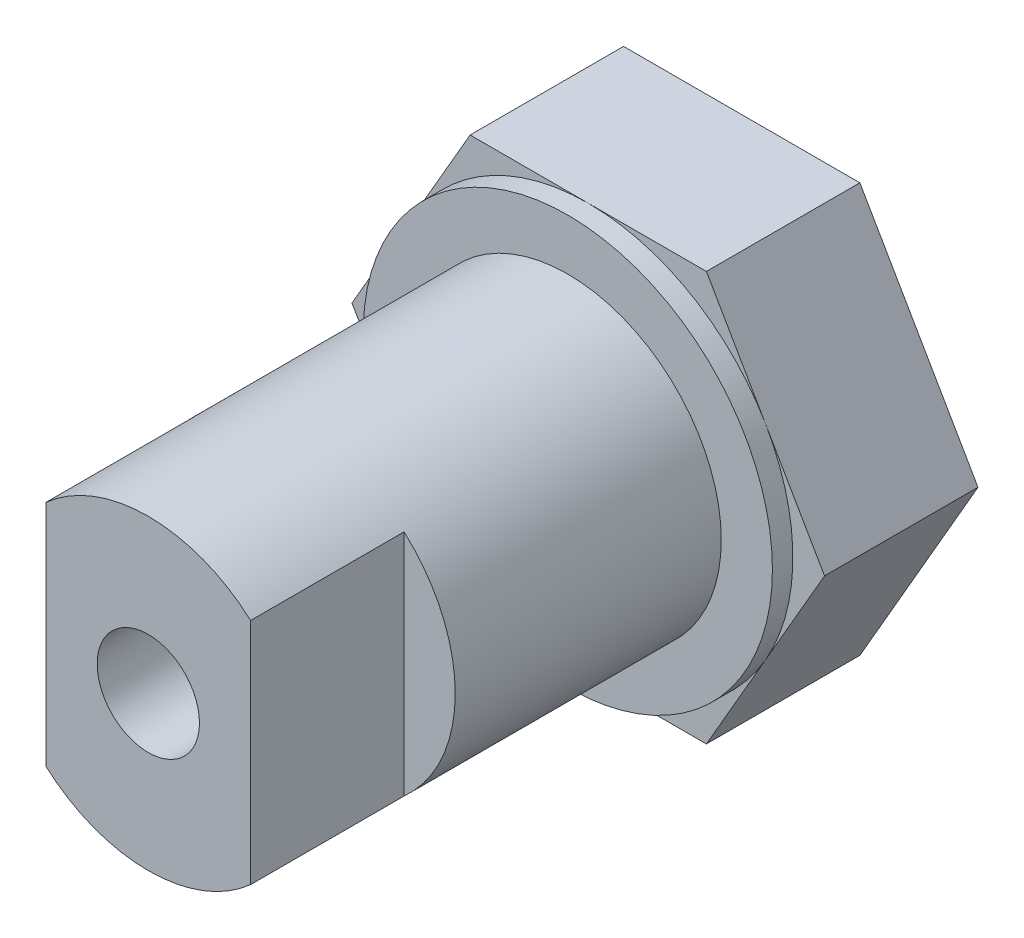
ISO-10303-21;
HEADER;
FILE_DESCRIPTION(('STEP AP214'),'2;1');
FILE_NAME('part.step','',(''),(''),'','','');
FILE_SCHEMA(('AUTOMOTIVE_DESIGN { 1 0 10303 214 1 1 1 1 }'));
ENDSEC;
DATA;
#1=APPLICATION_CONTEXT('core data for automotive mechanical design processes');
#2=APPLICATION_PROTOCOL_DEFINITION('international standard','automotive_design',2000,#1);
#3=PRODUCT_CONTEXT('',#1,'mechanical');
#4=PRODUCT('Part','Part','',(#3));
#5=PRODUCT_RELATED_PRODUCT_CATEGORY('part','',(#4));
#6=PRODUCT_DEFINITION_FORMATION('','',#4);
#7=PRODUCT_DEFINITION_CONTEXT('part definition',#1,'design');
#8=PRODUCT_DEFINITION('design','',#6,#7);
#9=PRODUCT_DEFINITION_SHAPE('','',#8);
#10=(LENGTH_UNIT() NAMED_UNIT(*) SI_UNIT(.MILLI.,.METRE.));
#11=(NAMED_UNIT(*) PLANE_ANGLE_UNIT() SI_UNIT($,.RADIAN.));
#12=(NAMED_UNIT(*) SI_UNIT($,.STERADIAN.) SOLID_ANGLE_UNIT());
#13=UNCERTAINTY_MEASURE_WITH_UNIT(LENGTH_MEASURE(1.E-05),#10,'distance_accuracy_value','');
#14=(GEOMETRIC_REPRESENTATION_CONTEXT(3) GLOBAL_UNCERTAINTY_ASSIGNED_CONTEXT((#13)) GLOBAL_UNIT_ASSIGNED_CONTEXT((#10,
#11,#12)) REPRESENTATION_CONTEXT('',''));
#15=CARTESIAN_POINT('',(0.,0.,0.));
#16=DIRECTION('',(0.,0.,1.));
#17=DIRECTION('',(1.,0.,0.));
#18=AXIS2_PLACEMENT_3D('',#15,#16,#17);
#19=CARTESIAN_POINT('',(0.,0.,58.));
#20=DIRECTION('',(0.,0.,-1.));
#21=DIRECTION('',(-1.,0.,0.));
#22=AXIS2_PLACEMENT_3D('',#19,#20,#21);
#23=CYLINDRICAL_SURFACE('',#22,15.);
#24=CARTESIAN_POINT('',(0.,0.,17.));
#25=DIRECTION('',(0.,0.,1.));
#26=DIRECTION('',(1.,0.,0.));
#27=AXIS2_PLACEMENT_3D('',#24,#25,#26);
#28=CIRCLE('',#27,15.);
#29=CARTESIAN_POINT('',(15.,0.,17.));
#30=VERTEX_POINT('',#29);
#31=EDGE_CURVE('E178',#30,#30,#28,.T.);
#32=ORIENTED_EDGE('',*,*,#31,.T.);
#33=EDGE_LOOP('',(#32));
#34=FACE_BOUND('',#33,.T.);
#35=DIRECTION('',(0.,0.,1.));
#36=VECTOR('',#35,1.);
#37=CARTESIAN_POINT('',(10.,-11.1803398874989,43.));
#38=LINE('',#37,#36);
#39=CARTESIAN_POINT('',(10.,-11.1803398874989,43.));
#40=VERTEX_POINT('',#39);
#41=CARTESIAN_POINT('',(10.,-11.1803398874989,58.));
#42=VERTEX_POINT('',#41);
#43=EDGE_CURVE('E141',#40,#42,#38,.T.);
#44=ORIENTED_EDGE('',*,*,#43,.T.);
#45=CARTESIAN_POINT('',(0.,0.,58.));
#46=DIRECTION('',(0.,0.,1.));
#47=DIRECTION('',(1.,0.,0.));
#48=AXIS2_PLACEMENT_3D('',#45,#46,#47);
#49=CIRCLE('',#48,15.);
#50=CARTESIAN_POINT('',(-10.,-11.1803398874989,58.));
#51=VERTEX_POINT('',#50);
#52=EDGE_CURVE('E179',#51,#42,#49,.T.);
#53=ORIENTED_EDGE('',*,*,#52,.F.);
#54=DIRECTION('',(0.,0.,1.));
#55=VECTOR('',#54,1.);
#56=CARTESIAN_POINT('',(-10.,-11.1803398874989,43.));
#57=LINE('',#56,#55);
#58=CARTESIAN_POINT('',(-10.,-11.1803398874989,43.));
#59=VERTEX_POINT('',#58);
#60=EDGE_CURVE('E70',#59,#51,#57,.T.);
#61=ORIENTED_EDGE('',*,*,#60,.F.);
#62=CARTESIAN_POINT('',(0.,0.,43.));
#63=DIRECTION('',(0.,0.,1.));
#64=DIRECTION('',(1.,0.,0.));
#65=AXIS2_PLACEMENT_3D('',#62,#63,#64);
#66=CIRCLE('',#65,15.);
#67=CARTESIAN_POINT('',(-10.,11.1803398874989,43.));
#68=VERTEX_POINT('',#67);
#69=EDGE_CURVE('E164',#68,#59,#66,.T.);
#70=ORIENTED_EDGE('',*,*,#69,.F.);
#71=DIRECTION('',(0.,0.,1.));
#72=VECTOR('',#71,1.);
#73=CARTESIAN_POINT('',(-10.,11.1803398874989,43.));
#74=LINE('',#73,#72);
#75=CARTESIAN_POINT('',(-10.,11.1803398874989,58.));
#76=VERTEX_POINT('',#75);
#77=EDGE_CURVE('E167',#68,#76,#74,.T.);
#78=ORIENTED_EDGE('',*,*,#77,.T.);
#79=CARTESIAN_POINT('',(10.,11.1803398874989,58.));
#80=VERTEX_POINT('',#79);
#81=EDGE_CURVE('E181',#80,#76,#49,.T.);
#82=ORIENTED_EDGE('',*,*,#81,.F.);
#83=DIRECTION('',(0.,0.,1.));
#84=VECTOR('',#83,1.);
#85=CARTESIAN_POINT('',(10.,11.1803398874989,43.));
#86=LINE('',#85,#84);
#87=CARTESIAN_POINT('',(10.,11.1803398874989,43.));
#88=VERTEX_POINT('',#87);
#89=EDGE_CURVE('E62',#88,#80,#86,.T.);
#90=ORIENTED_EDGE('',*,*,#89,.F.);
#91=CARTESIAN_POINT('',(0.,0.,43.));
#92=DIRECTION('',(0.,0.,1.));
#93=DIRECTION('',(1.,0.,0.));
#94=AXIS2_PLACEMENT_3D('',#91,#92,#93);
#95=CIRCLE('',#94,15.);
#96=EDGE_CURVE('E151',#40,#88,#95,.T.);
#97=ORIENTED_EDGE('',*,*,#96,.F.);
#98=EDGE_LOOP('',(#44,#53,#61,#70,#78,#82,#90,#97));
#99=FACE_BOUND('',#98,.T.);
#100=ADVANCED_FACE('F44',(#34,#99),#23,.T.);
#101=CARTESIAN_POINT('',(0.,0.,58.));
#102=DIRECTION('',(0.,0.,1.));
#103=DIRECTION('',(1.,0.,0.));
#104=AXIS2_PLACEMENT_3D('',#101,#102,#103);
#105=PLANE('',#104);
#106=CARTESIAN_POINT('',(0.,0.,58.));
#107=DIRECTION('',(0.,0.,1.));
#108=DIRECTION('',(1.,0.,0.));
#109=AXIS2_PLACEMENT_3D('',#106,#107,#108);
#110=CIRCLE('',#109,5.);
#111=CARTESIAN_POINT('',(5.,0.,58.));
#112=VERTEX_POINT('',#111);
#113=EDGE_CURVE('E170',#112,#112,#110,.T.);
#114=ORIENTED_EDGE('',*,*,#113,.F.);
#115=EDGE_LOOP('',(#114));
#116=FACE_BOUND('',#115,.T.);
#117=ORIENTED_EDGE('',*,*,#52,.T.);
#118=DIRECTION('',(0.,1.,0.));
#119=VECTOR('',#118,1.);
#120=CARTESIAN_POINT('',(10.,0.,58.));
#121=LINE('',#120,#119);
#122=EDGE_CURVE('E146',#42,#80,#121,.T.);
#123=ORIENTED_EDGE('',*,*,#122,.T.);
#124=ORIENTED_EDGE('',*,*,#81,.T.);
#125=DIRECTION('',(0.,-1.,0.));
#126=VECTOR('',#125,1.);
#127=CARTESIAN_POINT('',(-10.,0.,58.));
#128=LINE('',#127,#126);
#129=EDGE_CURVE('E160',#76,#51,#128,.T.);
#130=ORIENTED_EDGE('',*,*,#129,.T.);
#131=EDGE_LOOP('',(#117,#123,#124,#130));
#132=FACE_BOUND('',#131,.T.);
#133=ADVANCED_FACE('F297',(#116,#132),#105,.T.);
#134=CARTESIAN_POINT('',(0.,0.,15.));
#135=DIRECTION('',(0.,0.,1.));
#136=DIRECTION('',(1.,0.,0.));
#137=AXIS2_PLACEMENT_3D('',#134,#135,#136);
#138=PLANE('',#137);
#139=CARTESIAN_POINT('',(0.,0.,15.));
#140=DIRECTION('',(0.,0.,1.));
#141=DIRECTION('',(1.,0.,0.));
#142=AXIS2_PLACEMENT_3D('',#139,#140,#141);
#143=CIRCLE('',#142,20.);
#144=CARTESIAN_POINT('',(17.3205080756888,10.,15.));
#145=VERTEX_POINT('',#144);
#146=CARTESIAN_POINT('',(0.,20.,15.));
#147=VERTEX_POINT('',#146);
#148=EDGE_CURVE('E55',#145,#147,#143,.T.);
#149=ORIENTED_EDGE('',*,*,#148,.F.);
#150=DIRECTION('',(-0.5,0.866025403784438,0.));
#151=VECTOR('',#150,1.);
#152=CARTESIAN_POINT('',(23.094010767585,0.,15.));
#153=LINE('',#152,#151);
#154=CARTESIAN_POINT('',(11.5470053837925,20.,15.));
#155=VERTEX_POINT('',#154);
#156=EDGE_CURVE('E193',#145,#155,#153,.T.);
#157=ORIENTED_EDGE('',*,*,#156,.T.);
#158=DIRECTION('',(-1.,0.,0.));
#159=VECTOR('',#158,1.);
#160=CARTESIAN_POINT('',(11.5470053837925,20.,15.));
#161=LINE('',#160,#159);
#162=EDGE_CURVE('E194',#155,#147,#161,.T.);
#163=ORIENTED_EDGE('',*,*,#162,.T.);
#164=EDGE_LOOP('',(#149,#157,#163));
#165=FACE_BOUND('',#164,.T.);
#166=ADVANCED_FACE('F295',(#165),#138,.T.);
#167=CARTESIAN_POINT('',(-17.3205080756888,10.,15.));
#168=VERTEX_POINT('',#167);
#169=EDGE_CURVE('E13',#147,#168,#143,.T.);
#170=ORIENTED_EDGE('',*,*,#169,.F.);
#171=CARTESIAN_POINT('',(-11.5470053837925,20.,15.));
#172=VERTEX_POINT('',#171);
#173=EDGE_CURVE('E192',#147,#172,#161,.T.);
#174=ORIENTED_EDGE('',*,*,#173,.T.);
#175=DIRECTION('',(-0.5,-0.866025403784439,0.));
#176=VECTOR('',#175,1.);
#177=CARTESIAN_POINT('',(-11.5470053837925,20.,15.));
#178=LINE('',#177,#176);
#179=EDGE_CURVE('E198',#172,#168,#178,.T.);
#180=ORIENTED_EDGE('',*,*,#179,.T.);
#181=EDGE_LOOP('',(#170,#174,#180));
#182=FACE_BOUND('',#181,.T.);
#183=ADVANCED_FACE('F261',(#182),#138,.T.);
#184=CARTESIAN_POINT('',(-17.3205080756888,-10.,15.));
#185=VERTEX_POINT('',#184);
#186=EDGE_CURVE('E53',#168,#185,#143,.T.);
#187=ORIENTED_EDGE('',*,*,#186,.F.);
#188=CARTESIAN_POINT('',(-23.094010767585,0.,15.));
#189=VERTEX_POINT('',#188);
#190=EDGE_CURVE('E197',#168,#189,#178,.T.);
#191=ORIENTED_EDGE('',*,*,#190,.T.);
#192=DIRECTION('',(0.5,-0.866025403784438,0.));
#193=VECTOR('',#192,1.);
#194=CARTESIAN_POINT('',(-23.094010767585,0.,15.));
#195=LINE('',#194,#193);
#196=EDGE_CURVE('E202',#189,#185,#195,.T.);
#197=ORIENTED_EDGE('',*,*,#196,.T.);
#198=EDGE_LOOP('',(#187,#191,#197));
#199=FACE_BOUND('',#198,.T.);
#200=ADVANCED_FACE('F256',(#199),#138,.T.);
#201=CARTESIAN_POINT('',(0.,-20.,15.));
#202=VERTEX_POINT('',#201);
#203=EDGE_CURVE('E250',#185,#202,#143,.T.);
#204=ORIENTED_EDGE('',*,*,#203,.F.);
#205=CARTESIAN_POINT('',(-11.5470053837925,-20.,15.));
#206=VERTEX_POINT('',#205);
#207=EDGE_CURVE('E201',#185,#206,#195,.T.);
#208=ORIENTED_EDGE('',*,*,#207,.T.);
#209=DIRECTION('',(1.,0.,0.));
#210=VECTOR('',#209,1.);
#211=CARTESIAN_POINT('',(-11.5470053837925,-20.,15.));
#212=LINE('',#211,#210);
#213=EDGE_CURVE('E206',#206,#202,#212,.T.);
#214=ORIENTED_EDGE('',*,*,#213,.T.);
#215=EDGE_LOOP('',(#204,#208,#214));
#216=FACE_BOUND('',#215,.T.);
#217=ADVANCED_FACE('F276',(#216),#138,.T.);
#218=CARTESIAN_POINT('',(17.3205080756888,-9.99999999999999,15.));
#219=VERTEX_POINT('',#218);
#220=EDGE_CURVE('E247',#202,#219,#143,.T.);
#221=ORIENTED_EDGE('',*,*,#220,.F.);
#222=CARTESIAN_POINT('',(11.5470053837925,-20.,15.));
#223=VERTEX_POINT('',#222);
#224=EDGE_CURVE('E205',#202,#223,#212,.T.);
#225=ORIENTED_EDGE('',*,*,#224,.T.);
#226=DIRECTION('',(0.5,0.866025403784439,0.));
#227=VECTOR('',#226,1.);
#228=CARTESIAN_POINT('',(11.5470053837925,-20.,15.));
#229=LINE('',#228,#227);
#230=EDGE_CURVE('E210',#223,#219,#229,.T.);
#231=ORIENTED_EDGE('',*,*,#230,.T.);
#232=EDGE_LOOP('',(#221,#225,#231));
#233=FACE_BOUND('',#232,.T.);
#234=ADVANCED_FACE('F283',(#233),#138,.T.);
#235=CARTESIAN_POINT('',(23.094010767585,0.,15.));
#236=DIRECTION('',(-0.866025403784439,-0.5,0.));
#237=DIRECTION('',(0.5,-0.866025403784439,0.));
#238=AXIS2_PLACEMENT_3D('',#235,#236,#237);
#239=PLANE('',#238);
#240=DIRECTION('',(-0.5,0.866025403784438,0.));
#241=VECTOR('',#240,1.);
#242=CARTESIAN_POINT('',(23.094010767585,0.,0.));
#243=LINE('',#242,#241);
#244=CARTESIAN_POINT('',(23.094010767585,0.,0.));
#245=VERTEX_POINT('',#244);
#246=CARTESIAN_POINT('',(11.5470053837925,20.,0.));
#247=VERTEX_POINT('',#246);
#248=EDGE_CURVE('E186',#245,#247,#243,.T.);
#249=ORIENTED_EDGE('',*,*,#248,.T.);
#250=DIRECTION('',(0.,0.,-1.));
#251=VECTOR('',#250,1.);
#252=CARTESIAN_POINT('',(11.5470053837925,20.,15.));
#253=LINE('',#252,#251);
#254=EDGE_CURVE('E48',#155,#247,#253,.T.);
#255=ORIENTED_EDGE('',*,*,#254,.F.);
#256=ORIENTED_EDGE('',*,*,#156,.F.);
#257=CARTESIAN_POINT('',(23.094010767585,0.,15.));
#258=VERTEX_POINT('',#257);
#259=EDGE_CURVE('E190',#258,#145,#153,.T.);
#260=ORIENTED_EDGE('',*,*,#259,.F.);
#261=DIRECTION('',(0.,0.,-1.));
#262=VECTOR('',#261,1.);
#263=CARTESIAN_POINT('',(23.094010767585,0.,15.));
#264=LINE('',#263,#262);
#265=EDGE_CURVE('E213',#258,#245,#264,.T.);
#266=ORIENTED_EDGE('',*,*,#265,.T.);
#267=EDGE_LOOP('',(#249,#255,#256,#260,#266));
#268=FACE_BOUND('',#267,.T.);
#269=ADVANCED_FACE('F46',(#268),#239,.F.);
#270=CARTESIAN_POINT('',(11.5470053837925,20.,15.));
#271=DIRECTION('',(0.,-1.,0.));
#272=DIRECTION('',(0.,0.,-1.));
#273=AXIS2_PLACEMENT_3D('',#270,#271,#272);
#274=PLANE('',#273);
#275=DIRECTION('',(-1.,0.,0.));
#276=VECTOR('',#275,1.);
#277=CARTESIAN_POINT('',(11.5470053837925,20.,0.));
#278=LINE('',#277,#276);
#279=CARTESIAN_POINT('',(-11.5470053837925,20.,0.));
#280=VERTEX_POINT('',#279);
#281=EDGE_CURVE('E216',#247,#280,#278,.T.);
#282=ORIENTED_EDGE('',*,*,#281,.T.);
#283=DIRECTION('',(0.,0.,-1.));
#284=VECTOR('',#283,1.);
#285=CARTESIAN_POINT('',(-11.5470053837925,20.,15.));
#286=LINE('',#285,#284);
#287=EDGE_CURVE('E236',#172,#280,#286,.T.);
#288=ORIENTED_EDGE('',*,*,#287,.F.);
#289=ORIENTED_EDGE('',*,*,#173,.F.);
#290=ORIENTED_EDGE('',*,*,#162,.F.);
#291=ORIENTED_EDGE('',*,*,#254,.T.);
#292=EDGE_LOOP('',(#282,#288,#289,#290,#291));
#293=FACE_BOUND('',#292,.T.);
#294=ADVANCED_FACE('F263',(#293),#274,.F.);
#295=CARTESIAN_POINT('',(-11.5470053837925,20.,15.));
#296=DIRECTION('',(0.866025403784439,-0.5,0.));
#297=DIRECTION('',(0.5,0.866025403784439,0.));
#298=AXIS2_PLACEMENT_3D('',#295,#296,#297);
#299=PLANE('',#298);
#300=DIRECTION('',(-0.5,-0.866025403784439,0.));
#301=VECTOR('',#300,1.);
#302=CARTESIAN_POINT('',(-11.5470053837925,20.,0.));
#303=LINE('',#302,#301);
#304=CARTESIAN_POINT('',(-23.094010767585,0.,0.));
#305=VERTEX_POINT('',#304);
#306=EDGE_CURVE('E218',#280,#305,#303,.T.);
#307=ORIENTED_EDGE('',*,*,#306,.T.);
#308=DIRECTION('',(0.,0.,-1.));
#309=VECTOR('',#308,1.);
#310=CARTESIAN_POINT('',(-23.094010767585,0.,15.));
#311=LINE('',#310,#309);
#312=EDGE_CURVE('E234',#189,#305,#311,.T.);
#313=ORIENTED_EDGE('',*,*,#312,.F.);
#314=ORIENTED_EDGE('',*,*,#190,.F.);
#315=ORIENTED_EDGE('',*,*,#179,.F.);
#316=ORIENTED_EDGE('',*,*,#287,.T.);
#317=EDGE_LOOP('',(#307,#313,#314,#315,#316));
#318=FACE_BOUND('',#317,.T.);
#319=ADVANCED_FACE('F259',(#318),#299,.F.);
#320=CARTESIAN_POINT('',(-23.094010767585,0.,15.));
#321=DIRECTION('',(0.866025403784438,0.5,0.));
#322=DIRECTION('',(-0.5,0.866025403784439,0.));
#323=AXIS2_PLACEMENT_3D('',#320,#321,#322);
#324=PLANE('',#323);
#325=DIRECTION('',(0.5,-0.866025403784438,0.));
#326=VECTOR('',#325,1.);
#327=CARTESIAN_POINT('',(-23.094010767585,0.,0.));
#328=LINE('',#327,#326);
#329=CARTESIAN_POINT('',(-11.5470053837925,-20.,0.));
#330=VERTEX_POINT('',#329);
#331=EDGE_CURVE('E220',#305,#330,#328,.T.);
#332=ORIENTED_EDGE('',*,*,#331,.T.);
#333=DIRECTION('',(0.,0.,-1.));
#334=VECTOR('',#333,1.);
#335=CARTESIAN_POINT('',(-11.5470053837925,-20.,15.));
#336=LINE('',#335,#334);
#337=EDGE_CURVE('E231',#206,#330,#336,.T.);
#338=ORIENTED_EDGE('',*,*,#337,.F.);
#339=ORIENTED_EDGE('',*,*,#207,.F.);
#340=ORIENTED_EDGE('',*,*,#196,.F.);
#341=ORIENTED_EDGE('',*,*,#312,.T.);
#342=EDGE_LOOP('',(#332,#338,#339,#340,#341));
#343=FACE_BOUND('',#342,.T.);
#344=ADVANCED_FACE('F271',(#343),#324,.F.);
#345=CARTESIAN_POINT('',(-11.5470053837925,-20.,15.));
#346=DIRECTION('',(0.,1.,0.));
#347=DIRECTION('',(-1.,0.,0.));
#348=AXIS2_PLACEMENT_3D('',#345,#346,#347);
#349=PLANE('',#348);
#350=DIRECTION('',(1.,0.,0.));
#351=VECTOR('',#350,1.);
#352=CARTESIAN_POINT('',(-11.5470053837925,-20.,0.));
#353=LINE('',#352,#351);
#354=CARTESIAN_POINT('',(11.5470053837925,-20.,0.));
#355=VERTEX_POINT('',#354);
#356=EDGE_CURVE('E222',#330,#355,#353,.T.);
#357=ORIENTED_EDGE('',*,*,#356,.T.);
#358=DIRECTION('',(0.,0.,-1.));
#359=VECTOR('',#358,1.);
#360=CARTESIAN_POINT('',(11.5470053837925,-20.,15.));
#361=LINE('',#360,#359);
#362=EDGE_CURVE('E228',#223,#355,#361,.T.);
#363=ORIENTED_EDGE('',*,*,#362,.F.);
#364=ORIENTED_EDGE('',*,*,#224,.F.);
#365=ORIENTED_EDGE('',*,*,#213,.F.);
#366=ORIENTED_EDGE('',*,*,#337,.T.);
#367=EDGE_LOOP('',(#357,#363,#364,#365,#366));
#368=FACE_BOUND('',#367,.T.);
#369=ADVANCED_FACE('F279',(#368),#349,.F.);
#370=CARTESIAN_POINT('',(11.5470053837925,-20.,15.));
#371=DIRECTION('',(-0.866025403784439,0.5,0.));
#372=DIRECTION('',(-0.5,-0.866025403784439,0.));
#373=AXIS2_PLACEMENT_3D('',#370,#371,#372);
#374=PLANE('',#373);
#375=DIRECTION('',(0.5,0.866025403784439,0.));
#376=VECTOR('',#375,1.);
#377=CARTESIAN_POINT('',(11.5470053837925,-20.,0.));
#378=LINE('',#377,#376);
#379=EDGE_CURVE('E224',#355,#245,#378,.T.);
#380=ORIENTED_EDGE('',*,*,#379,.T.);
#381=ORIENTED_EDGE('',*,*,#265,.F.);
#382=EDGE_CURVE('E209',#219,#258,#229,.T.);
#383=ORIENTED_EDGE('',*,*,#382,.F.);
#384=ORIENTED_EDGE('',*,*,#230,.F.);
#385=ORIENTED_EDGE('',*,*,#362,.T.);
#386=EDGE_LOOP('',(#380,#381,#383,#384,#385));
#387=FACE_BOUND('',#386,.T.);
#388=ADVANCED_FACE('F286',(#387),#374,.F.);
#389=EDGE_CURVE('E189',#219,#145,#143,.T.);
#390=ORIENTED_EDGE('',*,*,#389,.F.);
#391=ORIENTED_EDGE('',*,*,#382,.T.);
#392=ORIENTED_EDGE('',*,*,#259,.T.);
#393=EDGE_LOOP('',(#390,#391,#392));
#394=FACE_BOUND('',#393,.T.);
#395=ADVANCED_FACE('F290',(#394),#138,.T.);
#396=CARTESIAN_POINT('',(0.,0.,0.));
#397=DIRECTION('',(0.,0.,1.));
#398=DIRECTION('',(1.,0.,0.));
#399=AXIS2_PLACEMENT_3D('',#396,#397,#398);
#400=PLANE('',#399);
#401=CARTESIAN_POINT('',(0.,0.,0.));
#402=DIRECTION('',(0.,0.,1.));
#403=DIRECTION('',(1.,0.,0.));
#404=AXIS2_PLACEMENT_3D('',#401,#402,#403);
#405=CIRCLE('',#404,5.);
#406=CARTESIAN_POINT('',(5.,0.,0.));
#407=VERTEX_POINT('',#406);
#408=EDGE_CURVE('E175',#407,#407,#405,.T.);
#409=ORIENTED_EDGE('',*,*,#408,.T.);
#410=EDGE_LOOP('',(#409));
#411=FACE_BOUND('',#410,.T.);
#412=ORIENTED_EDGE('',*,*,#248,.F.);
#413=ORIENTED_EDGE('',*,*,#379,.F.);
#414=ORIENTED_EDGE('',*,*,#356,.F.);
#415=ORIENTED_EDGE('',*,*,#331,.F.);
#416=ORIENTED_EDGE('',*,*,#306,.F.);
#417=ORIENTED_EDGE('',*,*,#281,.F.);
#418=EDGE_LOOP('',(#412,#413,#414,#415,#416,#417));
#419=FACE_BOUND('',#418,.T.);
#420=ADVANCED_FACE('F266',(#411,#419),#400,.F.);
#421=CARTESIAN_POINT('',(0.,0.,17.));
#422=DIRECTION('',(0.,0.,-1.));
#423=DIRECTION('',(-1.,0.,0.));
#424=AXIS2_PLACEMENT_3D('',#421,#422,#423);
#425=CYLINDRICAL_SURFACE('',#424,20.);
#426=CARTESIAN_POINT('',(0.,0.,17.));
#427=DIRECTION('',(0.,0.,1.));
#428=DIRECTION('',(1.,0.,0.));
#429=AXIS2_PLACEMENT_3D('',#426,#427,#428);
#430=CIRCLE('',#429,20.);
#431=CARTESIAN_POINT('',(20.,0.,17.));
#432=VERTEX_POINT('',#431);
#433=EDGE_CURVE('E184',#432,#432,#430,.T.);
#434=ORIENTED_EDGE('',*,*,#433,.F.);
#435=EDGE_LOOP('',(#434));
#436=FACE_BOUND('',#435,.T.);
#437=ORIENTED_EDGE('',*,*,#148,.T.);
#438=ORIENTED_EDGE('',*,*,#169,.T.);
#439=ORIENTED_EDGE('',*,*,#186,.T.);
#440=ORIENTED_EDGE('',*,*,#203,.T.);
#441=ORIENTED_EDGE('',*,*,#220,.T.);
#442=ORIENTED_EDGE('',*,*,#389,.T.);
#443=EDGE_LOOP('',(#437,#438,#439,#440,#441,#442));
#444=FACE_BOUND('',#443,.T.);
#445=ADVANCED_FACE('F253',(#436,#444),#425,.T.);
#446=CARTESIAN_POINT('',(0.,0.,17.));
#447=DIRECTION('',(0.,0.,1.));
#448=DIRECTION('',(1.,0.,0.));
#449=AXIS2_PLACEMENT_3D('',#446,#447,#448);
#450=PLANE('',#449);
#451=ORIENTED_EDGE('',*,*,#31,.F.);
#452=EDGE_LOOP('',(#451));
#453=FACE_BOUND('',#452,.T.);
#454=ORIENTED_EDGE('',*,*,#433,.T.);
#455=EDGE_LOOP('',(#454));
#456=FACE_BOUND('',#455,.T.);
#457=ADVANCED_FACE('F315',(#453,#456),#450,.T.);
#458=CARTESIAN_POINT('',(0.,0.,-42.));
#459=DIRECTION('',(0.,0.,1.));
#460=DIRECTION('',(1.,0.,0.));
#461=AXIS2_PLACEMENT_3D('',#458,#459,#460);
#462=CYLINDRICAL_SURFACE('',#461,5.);
#463=ORIENTED_EDGE('',*,*,#113,.T.);
#464=EDGE_LOOP('',(#463));
#465=FACE_BOUND('',#464,.T.);
#466=ORIENTED_EDGE('',*,*,#408,.F.);
#467=EDGE_LOOP('',(#466));
#468=FACE_BOUND('',#467,.T.);
#469=ADVANCED_FACE('F317',(#465,#468),#462,.F.);
#470=CARTESIAN_POINT('',(-10.,0.,43.));
#471=DIRECTION('',(-1.,0.,0.));
#472=DIRECTION('',(0.,0.,1.));
#473=AXIS2_PLACEMENT_3D('',#470,#471,#472);
#474=PLANE('',#473);
#475=ORIENTED_EDGE('',*,*,#129,.F.);
#476=ORIENTED_EDGE('',*,*,#77,.F.);
#477=DIRECTION('',(0.,-1.,0.));
#478=VECTOR('',#477,1.);
#479=CARTESIAN_POINT('',(-10.,0.,43.));
#480=LINE('',#479,#478);
#481=EDGE_CURVE('E162',#68,#59,#480,.T.);
#482=ORIENTED_EDGE('',*,*,#481,.T.);
#483=ORIENTED_EDGE('',*,*,#60,.T.);
#484=EDGE_LOOP('',(#475,#476,#482,#483));
#485=FACE_BOUND('',#484,.T.);
#486=ADVANCED_FACE('F380',(#485),#474,.T.);
#487=CARTESIAN_POINT('',(0.,0.,43.));
#488=DIRECTION('',(0.,0.,1.));
#489=DIRECTION('',(1.,0.,0.));
#490=AXIS2_PLACEMENT_3D('',#487,#488,#489);
#491=PLANE('',#490);
#492=ORIENTED_EDGE('',*,*,#481,.F.);
#493=ORIENTED_EDGE('',*,*,#69,.T.);
#494=EDGE_LOOP('',(#492,#493));
#495=FACE_BOUND('',#494,.T.);
#496=ADVANCED_FACE('F397',(#495),#491,.T.);
#497=CARTESIAN_POINT('',(10.,0.,43.));
#498=DIRECTION('',(1.,0.,0.));
#499=DIRECTION('',(0.,0.,-1.));
#500=AXIS2_PLACEMENT_3D('',#497,#498,#499);
#501=PLANE('',#500);
#502=ORIENTED_EDGE('',*,*,#122,.F.);
#503=ORIENTED_EDGE('',*,*,#43,.F.);
#504=DIRECTION('',(0.,1.,0.));
#505=VECTOR('',#504,1.);
#506=CARTESIAN_POINT('',(10.,0.,43.));
#507=LINE('',#506,#505);
#508=EDGE_CURVE('E144',#40,#88,#507,.T.);
#509=ORIENTED_EDGE('',*,*,#508,.T.);
#510=ORIENTED_EDGE('',*,*,#89,.T.);
#511=EDGE_LOOP('',(#502,#503,#509,#510));
#512=FACE_BOUND('',#511,.T.);
#513=ADVANCED_FACE('F143',(#512),#501,.T.);
#514=CARTESIAN_POINT('',(0.,0.,43.));
#515=DIRECTION('',(0.,0.,1.));
#516=DIRECTION('',(1.,0.,0.));
#517=AXIS2_PLACEMENT_3D('',#514,#515,#516);
#518=PLANE('',#517);
#519=ORIENTED_EDGE('',*,*,#508,.F.);
#520=ORIENTED_EDGE('',*,*,#96,.T.);
#521=EDGE_LOOP('',(#519,#520));
#522=FACE_BOUND('',#521,.T.);
#523=ADVANCED_FACE('F154',(#522),#518,.T.);
#524=CLOSED_SHELL('',(#100,#133,#166,#183,#200,#217,#234,#269,#294,#319,#344,#369,#388,#395,
#420,#445,#457,#469,#486,#496,#513,#523));
#525=MANIFOLD_SOLID_BREP('B2',#524);
#526=ADVANCED_BREP_SHAPE_REPRESENTATION('',(#18,#525),#14);
#527=SHAPE_DEFINITION_REPRESENTATION(#9,#526);
ENDSEC;
END-ISO-10303-21;
